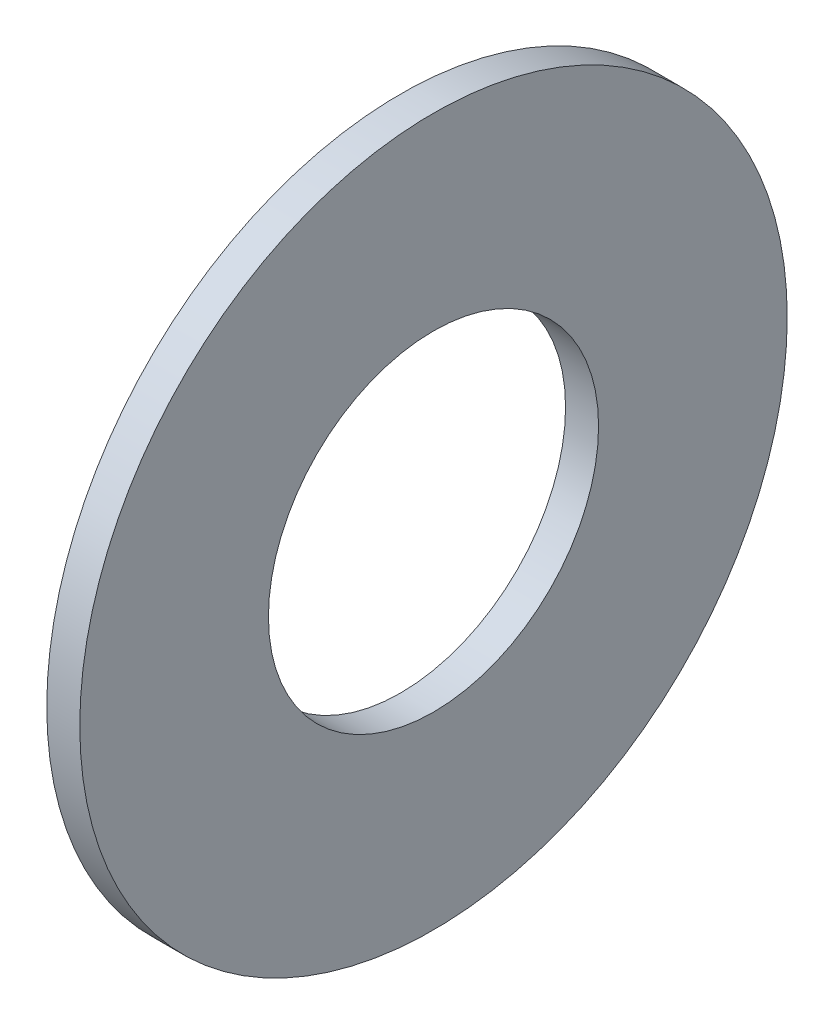
ISO-10303-21;
HEADER;
FILE_DESCRIPTION(('STEP AP214'),'2;1');
FILE_NAME('part.step','',(''),(''),'','','');
FILE_SCHEMA(('AUTOMOTIVE_DESIGN { 1 0 10303 214 1 1 1 1 }'));
ENDSEC;
DATA;
#1=APPLICATION_CONTEXT('core data for automotive mechanical design processes');
#2=APPLICATION_PROTOCOL_DEFINITION('international standard','automotive_design',2000,#1);
#3=PRODUCT_CONTEXT('',#1,'mechanical');
#4=PRODUCT('Part','Part','',(#3));
#5=PRODUCT_RELATED_PRODUCT_CATEGORY('part','',(#4));
#6=PRODUCT_DEFINITION_FORMATION('','',#4);
#7=PRODUCT_DEFINITION_CONTEXT('part definition',#1,'design');
#8=PRODUCT_DEFINITION('design','',#6,#7);
#9=PRODUCT_DEFINITION_SHAPE('','',#8);
#10=(LENGTH_UNIT() NAMED_UNIT(*) SI_UNIT(.MILLI.,.METRE.));
#11=(NAMED_UNIT(*) PLANE_ANGLE_UNIT() SI_UNIT($,.RADIAN.));
#12=(NAMED_UNIT(*) SI_UNIT($,.STERADIAN.) SOLID_ANGLE_UNIT());
#13=UNCERTAINTY_MEASURE_WITH_UNIT(LENGTH_MEASURE(1.E-05),#10,'distance_accuracy_value','');
#14=(GEOMETRIC_REPRESENTATION_CONTEXT(3) GLOBAL_UNCERTAINTY_ASSIGNED_CONTEXT((#13)) GLOBAL_UNIT_ASSIGNED_CONTEXT((#10,
#11,#12)) REPRESENTATION_CONTEXT('',''));
#15=CARTESIAN_POINT('',(0.,0.,0.));
#16=DIRECTION('',(0.,0.,1.));
#17=DIRECTION('',(1.,0.,0.));
#18=AXIS2_PLACEMENT_3D('',#15,#16,#17);
#19=CARTESIAN_POINT('',(19.75,-1.65,0.));
#20=DIRECTION('',(1.,0.,0.));
#21=DIRECTION('',(0.,0.,-1.));
#22=AXIS2_PLACEMENT_3D('',#19,#20,#21);
#23=PLANE('',#22);
#24=CARTESIAN_POINT('',(19.75,0.,0.));
#25=DIRECTION('',(1.,0.,0.));
#26=DIRECTION('',(0.,0.,-1.));
#27=AXIS2_PLACEMENT_3D('',#24,#25,#26);
#28=CIRCLE('',#27,1.05);
#29=CARTESIAN_POINT('',(19.75,0.,-1.05));
#30=VERTEX_POINT('',#29);
#31=EDGE_CURVE('E17',#30,#30,#28,.F.);
#32=ORIENTED_EDGE('',*,*,#31,.T.);
#33=EDGE_LOOP('',(#32));
#34=FACE_BOUND('',#33,.T.);
#35=CARTESIAN_POINT('',(19.75,0.,0.));
#36=DIRECTION('',(1.,0.,0.));
#37=DIRECTION('',(0.,0.,-1.));
#38=AXIS2_PLACEMENT_3D('',#35,#36,#37);
#39=CIRCLE('',#38,2.25);
#40=CARTESIAN_POINT('',(19.75,0.,-2.25));
#41=VERTEX_POINT('',#40);
#42=EDGE_CURVE('E26',#41,#41,#39,.F.);
#43=ORIENTED_EDGE('',*,*,#42,.F.);
#44=EDGE_LOOP('',(#43));
#45=FACE_BOUND('',#44,.T.);
#46=ADVANCED_FACE('F14',(#34,#45),#23,.T.);
#47=CARTESIAN_POINT('',(19.645,0.,0.));
#48=DIRECTION('',(1.,0.,0.));
#49=DIRECTION('',(0.,0.,-1.));
#50=AXIS2_PLACEMENT_3D('',#47,#48,#49);
#51=CYLINDRICAL_SURFACE('',#50,1.05);
#52=ORIENTED_EDGE('',*,*,#31,.F.);
#53=EDGE_LOOP('',(#52));
#54=FACE_BOUND('',#53,.T.);
#55=CARTESIAN_POINT('',(19.54,0.,0.));
#56=DIRECTION('',(1.,0.,0.));
#57=DIRECTION('',(0.,0.,-1.));
#58=AXIS2_PLACEMENT_3D('',#55,#56,#57);
#59=CIRCLE('',#58,1.05);
#60=CARTESIAN_POINT('',(19.54,0.,-1.05));
#61=VERTEX_POINT('',#60);
#62=EDGE_CURVE('E21',#61,#61,#59,.T.);
#63=ORIENTED_EDGE('',*,*,#62,.F.);
#64=EDGE_LOOP('',(#63));
#65=FACE_BOUND('',#64,.T.);
#66=ADVANCED_FACE('F36',(#54,#65),#51,.F.);
#67=CARTESIAN_POINT('',(19.645,0.,0.));
#68=DIRECTION('',(1.,0.,0.));
#69=DIRECTION('',(0.,0.,-1.));
#70=AXIS2_PLACEMENT_3D('',#67,#68,#69);
#71=CYLINDRICAL_SURFACE('',#70,2.25);
#72=CARTESIAN_POINT('',(19.54,0.,0.));
#73=DIRECTION('',(1.,0.,0.));
#74=DIRECTION('',(0.,0.,-1.));
#75=AXIS2_PLACEMENT_3D('',#72,#73,#74);
#76=CIRCLE('',#75,2.25);
#77=CARTESIAN_POINT('',(19.54,0.,-2.25));
#78=VERTEX_POINT('',#77);
#79=EDGE_CURVE('E10',#78,#78,#76,.F.);
#80=ORIENTED_EDGE('',*,*,#79,.F.);
#81=EDGE_LOOP('',(#80));
#82=FACE_BOUND('',#81,.T.);
#83=ORIENTED_EDGE('',*,*,#42,.T.);
#84=EDGE_LOOP('',(#83));
#85=FACE_BOUND('',#84,.T.);
#86=ADVANCED_FACE('F39',(#82,#85),#71,.T.);
#87=CARTESIAN_POINT('',(19.54,-1.65,0.));
#88=DIRECTION('',(-1.,0.,0.));
#89=DIRECTION('',(0.,0.,1.));
#90=AXIS2_PLACEMENT_3D('',#87,#88,#89);
#91=PLANE('',#90);
#92=ORIENTED_EDGE('',*,*,#79,.T.);
#93=EDGE_LOOP('',(#92));
#94=FACE_BOUND('',#93,.T.);
#95=ORIENTED_EDGE('',*,*,#62,.T.);
#96=EDGE_LOOP('',(#95));
#97=FACE_BOUND('',#96,.T.);
#98=ADVANCED_FACE('F42',(#94,#97),#91,.T.);
#99=CLOSED_SHELL('',(#46,#66,#86,#98));
#100=MANIFOLD_SOLID_BREP('B1',#99);
#101=ADVANCED_BREP_SHAPE_REPRESENTATION('',(#18,#100),#14);
#102=SHAPE_DEFINITION_REPRESENTATION(#9,#101);
ENDSEC;
END-ISO-10303-21;
